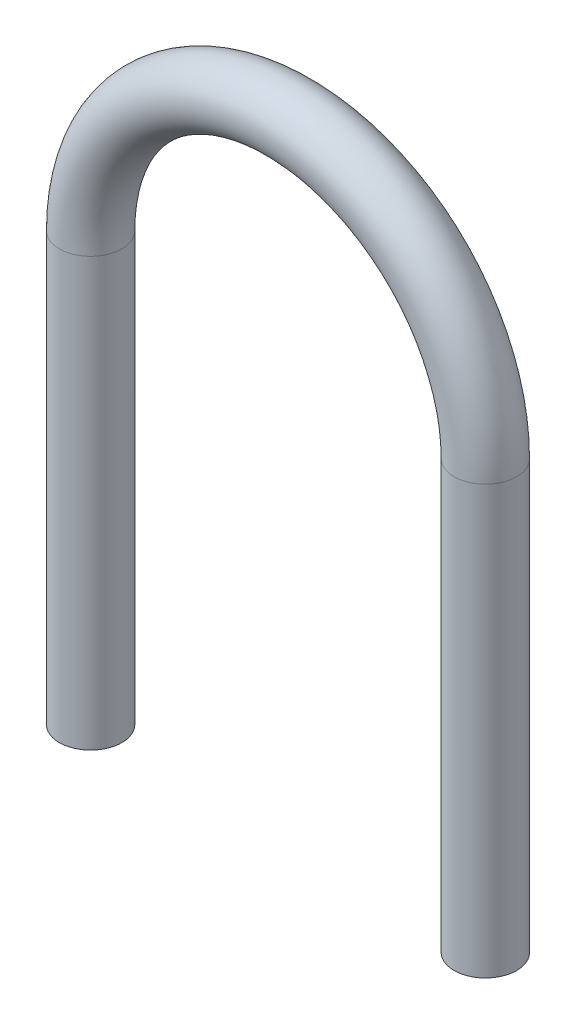
ISO-10303-21;
HEADER;
FILE_DESCRIPTION(('STEP AP214'),'2;1');
FILE_NAME('part.step','',(''),(''),'','','');
FILE_SCHEMA(('AUTOMOTIVE_DESIGN { 1 0 10303 214 1 1 1 1 }'));
ENDSEC;
DATA;
#1=APPLICATION_CONTEXT('core data for automotive mechanical design processes');
#2=APPLICATION_PROTOCOL_DEFINITION('international standard','automotive_design',2000,#1);
#3=PRODUCT_CONTEXT('',#1,'mechanical');
#4=PRODUCT('Part','Part','',(#3));
#5=PRODUCT_RELATED_PRODUCT_CATEGORY('part','',(#4));
#6=PRODUCT_DEFINITION_FORMATION('','',#4);
#7=PRODUCT_DEFINITION_CONTEXT('part definition',#1,'design');
#8=PRODUCT_DEFINITION('design','',#6,#7);
#9=PRODUCT_DEFINITION_SHAPE('','',#8);
#10=(LENGTH_UNIT() NAMED_UNIT(*) SI_UNIT(.MILLI.,.METRE.));
#11=(NAMED_UNIT(*) PLANE_ANGLE_UNIT() SI_UNIT($,.RADIAN.));
#12=(NAMED_UNIT(*) SI_UNIT($,.STERADIAN.) SOLID_ANGLE_UNIT());
#13=UNCERTAINTY_MEASURE_WITH_UNIT(LENGTH_MEASURE(1.E-05),#10,'distance_accuracy_value','');
#14=(GEOMETRIC_REPRESENTATION_CONTEXT(3) GLOBAL_UNCERTAINTY_ASSIGNED_CONTEXT((#13)) GLOBAL_UNIT_ASSIGNED_CONTEXT((#10,
#11,#12)) REPRESENTATION_CONTEXT('',''));
#15=CARTESIAN_POINT('',(0.,0.,0.));
#16=DIRECTION('',(0.,0.,1.));
#17=DIRECTION('',(1.,0.,0.));
#18=AXIS2_PLACEMENT_3D('',#15,#16,#17);
#19=CARTESIAN_POINT('',(0.,-7.5,0.));
#20=DIRECTION('',(0.,1.,0.));
#21=DIRECTION('',(0.,0.,1.));
#22=AXIS2_PLACEMENT_3D('',#19,#20,#21);
#23=PLANE('',#22);
#24=CARTESIAN_POINT('',(0.,-7.5,0.));
#25=DIRECTION('',(0.,1.,0.));
#26=DIRECTION('',(0.,0.,1.));
#27=AXIS2_PLACEMENT_3D('',#24,#25,#26);
#28=CIRCLE('',#27,1.425);
#29=CARTESIAN_POINT('',(0.,-7.5,1.425));
#30=VERTEX_POINT('',#29);
#31=EDGE_CURVE('E52',#30,#30,#28,.T.);
#32=ORIENTED_EDGE('',*,*,#31,.F.);
#33=EDGE_LOOP('',(#32));
#34=FACE_BOUND('',#33,.T.);
#35=ADVANCED_FACE('F35',(#34),#23,.F.);
#36=CARTESIAN_POINT('',(18.,-7.5,0.));
#37=DIRECTION('',(0.,-1.,0.));
#38=DIRECTION('',(0.,0.,1.));
#39=AXIS2_PLACEMENT_3D('',#36,#37,#38);
#40=PLANE('',#39);
#41=CARTESIAN_POINT('',(18.,-7.5,0.));
#42=DIRECTION('',(0.,-1.,0.));
#43=DIRECTION('',(0.,0.,1.));
#44=AXIS2_PLACEMENT_3D('',#41,#42,#43);
#45=CIRCLE('',#44,1.425);
#46=CARTESIAN_POINT('',(18.,-7.5,1.425));
#47=VERTEX_POINT('',#46);
#48=EDGE_CURVE('E10',#47,#47,#45,.T.);
#49=ORIENTED_EDGE('',*,*,#48,.T.);
#50=EDGE_LOOP('',(#49));
#51=FACE_BOUND('',#50,.T.);
#52=ADVANCED_FACE('F62',(#51),#40,.T.);
#53=CARTESIAN_POINT('',(0.,-7.5,0.));
#54=DIRECTION('',(0.,1.,0.));
#55=DIRECTION('',(0.,0.,1.));
#56=AXIS2_PLACEMENT_3D('',#53,#54,#55);
#57=CYLINDRICAL_SURFACE('',#56,1.425);
#58=CARTESIAN_POINT('',(0.,12.,0.));
#59=DIRECTION('',(0.,1.,0.));
#60=DIRECTION('',(0.,0.,1.));
#61=AXIS2_PLACEMENT_3D('',#58,#59,#60);
#62=CIRCLE('',#61,1.425);
#63=CARTESIAN_POINT('',(-1.425,12.,0.));
#64=VERTEX_POINT('',#63);
#65=EDGE_CURVE('E47',#64,#64,#62,.T.);
#66=ORIENTED_EDGE('',*,*,#65,.F.);
#67=EDGE_LOOP('',(#66));
#68=FACE_BOUND('',#67,.T.);
#69=ORIENTED_EDGE('',*,*,#31,.T.);
#70=EDGE_LOOP('',(#69));
#71=FACE_BOUND('',#70,.T.);
#72=ADVANCED_FACE('F59',(#68,#71),#57,.T.);
#73=CARTESIAN_POINT('',(9.,12.,0.));
#74=DIRECTION('',(0.,0.,-1.));
#75=DIRECTION('',(-1.,0.,0.));
#76=AXIS2_PLACEMENT_3D('',#73,#74,#75);
#77=TOROIDAL_SURFACE('',#76,9.,1.425);
#78=CARTESIAN_POINT('',(18.,12.,0.));
#79=DIRECTION('',(0.,-1.,0.));
#80=DIRECTION('',(0.,0.,1.));
#81=AXIS2_PLACEMENT_3D('',#78,#79,#80);
#82=CIRCLE('',#81,1.425);
#83=CARTESIAN_POINT('',(19.425,12.,0.));
#84=VERTEX_POINT('',#83);
#85=EDGE_CURVE('E42',#84,#84,#82,.T.);
#86=CARTESIAN_POINT('',(9.,12.,0.));
#87=DIRECTION('',(0.,0.,-1.));
#88=DIRECTION('',(-1.,0.,0.));
#89=AXIS2_PLACEMENT_3D('',#86,#87,#88);
#90=CIRCLE('',#89,10.425);
#91=EDGE_CURVE('',#64,#84,#90,.T.);
#92=ORIENTED_EDGE('',*,*,#65,.T.);
#93=ORIENTED_EDGE('',*,*,#85,.F.);
#94=ORIENTED_EDGE('',*,*,#91,.T.);
#95=ORIENTED_EDGE('',*,*,#91,.F.);
#96=EDGE_LOOP('',(#92,#94,#93,#95));
#97=FACE_BOUND('',#96,.T.);
#98=ADVANCED_FACE('F68',(#97),#77,.T.);
#99=CARTESIAN_POINT('',(18.,12.,0.));
#100=DIRECTION('',(0.,-1.,0.));
#101=DIRECTION('',(1.,0.,0.));
#102=AXIS2_PLACEMENT_3D('',#99,#100,#101);
#103=CYLINDRICAL_SURFACE('',#102,1.425);
#104=ORIENTED_EDGE('',*,*,#48,.F.);
#105=EDGE_LOOP('',(#104));
#106=FACE_BOUND('',#105,.T.);
#107=ORIENTED_EDGE('',*,*,#85,.T.);
#108=EDGE_LOOP('',(#107));
#109=FACE_BOUND('',#108,.T.);
#110=ADVANCED_FACE('F66',(#106,#109),#103,.T.);
#111=CLOSED_SHELL('',(#35,#52,#72,#98,#110));
#112=MANIFOLD_SOLID_BREP('B2',#111);
#113=ADVANCED_BREP_SHAPE_REPRESENTATION('',(#18,#112),#14);
#114=SHAPE_DEFINITION_REPRESENTATION(#9,#113);
ENDSEC;
END-ISO-10303-21;
